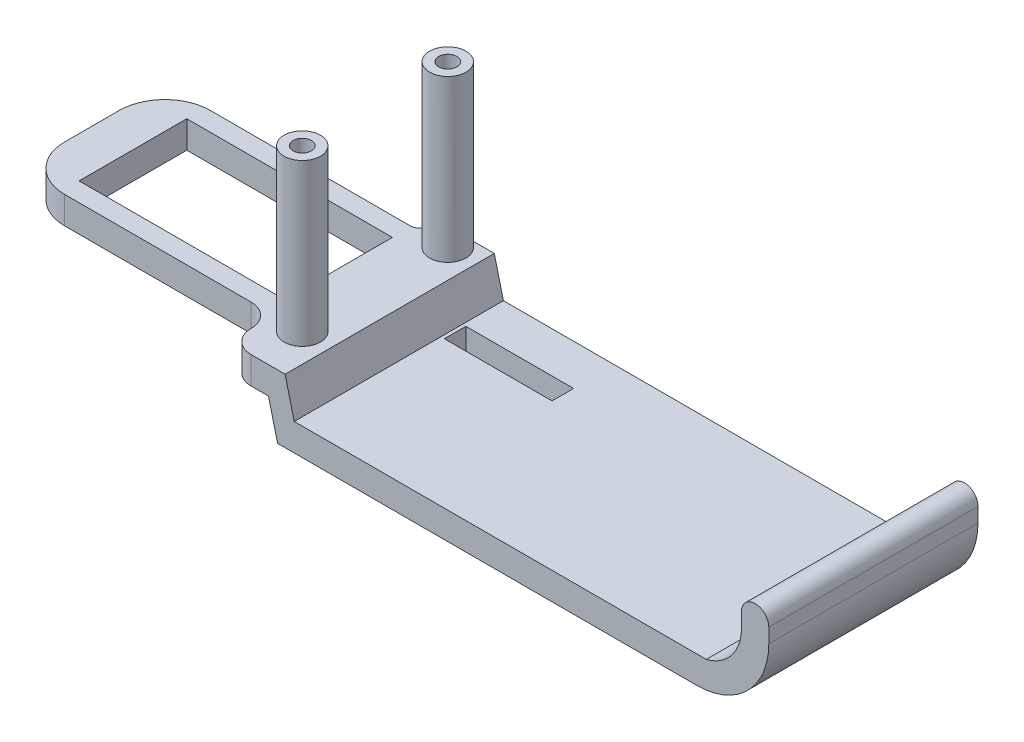
ISO-10303-21;
HEADER;
FILE_DESCRIPTION(('STEP AP214'),'2;1');
FILE_NAME('part.step','',(''),(''),'','','');
FILE_SCHEMA(('AUTOMOTIVE_DESIGN { 1 0 10303 214 1 1 1 1 }'));
ENDSEC;
DATA;
#1=APPLICATION_CONTEXT('core data for automotive mechanical design processes');
#2=APPLICATION_PROTOCOL_DEFINITION('international standard','automotive_design',2000,#1);
#3=PRODUCT_CONTEXT('',#1,'mechanical');
#4=PRODUCT('Part','Part','',(#3));
#5=PRODUCT_RELATED_PRODUCT_CATEGORY('part','',(#4));
#6=PRODUCT_DEFINITION_FORMATION('','',#4);
#7=PRODUCT_DEFINITION_CONTEXT('part definition',#1,'design');
#8=PRODUCT_DEFINITION('design','',#6,#7);
#9=PRODUCT_DEFINITION_SHAPE('','',#8);
#10=(LENGTH_UNIT() NAMED_UNIT(*) SI_UNIT(.MILLI.,.METRE.));
#11=(NAMED_UNIT(*) PLANE_ANGLE_UNIT() SI_UNIT($,.RADIAN.));
#12=(NAMED_UNIT(*) SI_UNIT($,.STERADIAN.) SOLID_ANGLE_UNIT());
#13=UNCERTAINTY_MEASURE_WITH_UNIT(LENGTH_MEASURE(1.E-05),#10,'distance_accuracy_value','');
#14=(GEOMETRIC_REPRESENTATION_CONTEXT(3) GLOBAL_UNCERTAINTY_ASSIGNED_CONTEXT((#13)) GLOBAL_UNIT_ASSIGNED_CONTEXT((#10,
#11,#12)) REPRESENTATION_CONTEXT('',''));
#15=CARTESIAN_POINT('',(0.,0.,0.));
#16=DIRECTION('',(0.,0.,1.));
#17=DIRECTION('',(1.,0.,0.));
#18=AXIS2_PLACEMENT_3D('',#15,#16,#17);
#19=CARTESIAN_POINT('',(0.,3.,0.));
#20=DIRECTION('',(0.,1.,0.));
#21=DIRECTION('',(0.,0.,1.));
#22=AXIS2_PLACEMENT_3D('',#19,#20,#21);
#23=PLANE('',#22);
#24=DIRECTION('',(1.,0.,0.));
#25=VECTOR('',#24,1.);
#26=CARTESIAN_POINT('',(0.,3.,-13.92));
#27=LINE('',#26,#25);
#28=CARTESIAN_POINT('',(4.5,3.,-13.92));
#29=VERTEX_POINT('',#28);
#30=CARTESIAN_POINT('',(27.1,3.,-13.92));
#31=VERTEX_POINT('',#30);
#32=EDGE_CURVE('E376',#29,#31,#27,.T.);
#33=ORIENTED_EDGE('',*,*,#32,.T.);
#34=DIRECTION('',(0.,0.,1.));
#35=VECTOR('',#34,1.);
#36=CARTESIAN_POINT('',(27.1,3.,0.));
#37=LINE('',#36,#35);
#38=CARTESIAN_POINT('',(27.1,3.,-2.08));
#39=VERTEX_POINT('',#38);
#40=EDGE_CURVE('E379',#31,#39,#37,.T.);
#41=ORIENTED_EDGE('',*,*,#40,.T.);
#42=DIRECTION('',(1.,0.,0.));
#43=VECTOR('',#42,1.);
#44=CARTESIAN_POINT('',(0.,3.,-2.08));
#45=LINE('',#44,#43);
#46=CARTESIAN_POINT('',(4.5,3.,-2.08));
#47=VERTEX_POINT('',#46);
#48=EDGE_CURVE('E381',#47,#39,#45,.T.);
#49=ORIENTED_EDGE('',*,*,#48,.F.);
#50=DIRECTION('',(0.,0.,1.));
#51=VECTOR('',#50,1.);
#52=CARTESIAN_POINT('',(4.5,3.,0.));
#53=LINE('',#52,#51);
#54=EDGE_CURVE('E384',#29,#47,#53,.T.);
#55=ORIENTED_EDGE('',*,*,#54,.F.);
#56=EDGE_LOOP('',(#33,#41,#49,#55));
#57=FACE_BOUND('',#56,.T.);
#58=DIRECTION('',(1.,0.,0.));
#59=VECTOR('',#58,1.);
#60=CARTESIAN_POINT('',(0.,3.,0.));
#61=LINE('',#60,#59);
#62=CARTESIAN_POINT('',(5.,3.,0.));
#63=VERTEX_POINT('',#62);
#64=CARTESIAN_POINT('',(25.5,3.,0.));
#65=VERTEX_POINT('',#64);
#66=EDGE_CURVE('E374',#63,#65,#61,.T.);
#67=ORIENTED_EDGE('',*,*,#66,.T.);
#68=CARTESIAN_POINT('',(25.5,3.,2.5));
#69=DIRECTION('',(0.,1.,0.));
#70=DIRECTION('',(0.,0.,1.));
#71=AXIS2_PLACEMENT_3D('',#68,#69,#70);
#72=CIRCLE('',#71,2.5);
#73=CARTESIAN_POINT('',(28.,3.,2.5));
#74=VERTEX_POINT('',#73);
#75=EDGE_CURVE('E11',#65,#74,#72,.F.);
#76=ORIENTED_EDGE('',*,*,#75,.T.);
#77=CARTESIAN_POINT('',(30.5,3.,2.5));
#78=DIRECTION('',(0.,1.,0.));
#79=DIRECTION('',(0.,0.,1.));
#80=AXIS2_PLACEMENT_3D('',#77,#78,#79);
#81=CIRCLE('',#80,2.5);
#82=CARTESIAN_POINT('',(30.5,3.,5.));
#83=VERTEX_POINT('',#82);
#84=EDGE_CURVE('E475',#74,#83,#81,.T.);
#85=ORIENTED_EDGE('',*,*,#84,.T.);
#86=DIRECTION('',(1.,0.,0.));
#87=VECTOR('',#86,1.);
#88=CARTESIAN_POINT('',(28.,3.,5.));
#89=LINE('',#88,#87);
#90=CARTESIAN_POINT('',(34.226941016011,3.,5.));
#91=VERTEX_POINT('',#90);
#92=EDGE_CURVE('E353',#83,#91,#89,.T.);
#93=ORIENTED_EDGE('',*,*,#92,.T.);
#94=DIRECTION('',(0.,0.,-1.));
#95=VECTOR('',#94,1.);
#96=CARTESIAN_POINT('',(34.226941016011,3.,5.));
#97=LINE('',#96,#95);
#98=CARTESIAN_POINT('',(34.226941016011,3.,-18.));
#99=VERTEX_POINT('',#98);
#100=EDGE_CURVE('E364',#91,#99,#97,.T.);
#101=ORIENTED_EDGE('',*,*,#100,.T.);
#102=DIRECTION('',(1.,0.,0.));
#103=VECTOR('',#102,1.);
#104=CARTESIAN_POINT('',(28.,3.,-18.));
#105=LINE('',#104,#103);
#106=CARTESIAN_POINT('',(31.1134705080055,3.,-18.));
#107=VERTEX_POINT('',#106);
#108=EDGE_CURVE('E337',#107,#99,#105,.T.);
#109=ORIENTED_EDGE('',*,*,#108,.F.);
#110=CARTESIAN_POINT('',(31.1134705080055,3.,-16.));
#111=DIRECTION('',(0.,1.,0.));
#112=DIRECTION('',(0.,0.,1.));
#113=AXIS2_PLACEMENT_3D('',#110,#111,#112);
#114=CIRCLE('',#113,2.00000000000002);
#115=EDGE_CURVE('E321',#107,#107,#114,.T.);
#116=ORIENTED_EDGE('',*,*,#115,.F.);
#117=CARTESIAN_POINT('',(29.,3.,-18.));
#118=VERTEX_POINT('',#117);
#119=EDGE_CURVE('E338',#118,#107,#105,.T.);
#120=ORIENTED_EDGE('',*,*,#119,.F.);
#121=CARTESIAN_POINT('',(29.,3.,-17.));
#122=DIRECTION('',(0.,1.,0.));
#123=DIRECTION('',(0.,0.,1.));
#124=AXIS2_PLACEMENT_3D('',#121,#122,#123);
#125=CIRCLE('',#124,1.);
#126=CARTESIAN_POINT('',(28.,3.,-17.));
#127=VERTEX_POINT('',#126);
#128=EDGE_CURVE('E437',#118,#127,#125,.T.);
#129=ORIENTED_EDGE('',*,*,#128,.T.);
#130=CARTESIAN_POINT('',(27.,3.,-17.));
#131=DIRECTION('',(0.,1.,0.));
#132=DIRECTION('',(0.,0.,1.));
#133=AXIS2_PLACEMENT_3D('',#130,#131,#132);
#134=CIRCLE('',#133,1.);
#135=CARTESIAN_POINT('',(27.,3.,-16.));
#136=VERTEX_POINT('',#135);
#137=EDGE_CURVE('E426',#127,#136,#134,.F.);
#138=ORIENTED_EDGE('',*,*,#137,.T.);
#139=DIRECTION('',(1.,0.,0.));
#140=VECTOR('',#139,1.);
#141=CARTESIAN_POINT('',(0.,3.,-16.));
#142=LINE('',#141,#140);
#143=CARTESIAN_POINT('',(5.,3.,-16.));
#144=VERTEX_POINT('',#143);
#145=EDGE_CURVE('E375',#144,#136,#142,.T.);
#146=ORIENTED_EDGE('',*,*,#145,.F.);
#147=CARTESIAN_POINT('',(5.,3.,-11.));
#148=DIRECTION('',(0.,1.,0.));
#149=DIRECTION('',(0.,0.,1.));
#150=AXIS2_PLACEMENT_3D('',#147,#148,#149);
#151=CIRCLE('',#150,5.);
#152=CARTESIAN_POINT('',(0.,3.,-11.));
#153=VERTEX_POINT('',#152);
#154=EDGE_CURVE('E465',#144,#153,#151,.T.);
#155=ORIENTED_EDGE('',*,*,#154,.T.);
#156=DIRECTION('',(0.,0.,1.));
#157=VECTOR('',#156,1.);
#158=CARTESIAN_POINT('',(0.,3.,0.));
#159=LINE('',#158,#157);
#160=CARTESIAN_POINT('',(0.,3.,-5.));
#161=VERTEX_POINT('',#160);
#162=EDGE_CURVE('E371',#153,#161,#159,.T.);
#163=ORIENTED_EDGE('',*,*,#162,.T.);
#164=CARTESIAN_POINT('',(5.,3.,-5.));
#165=DIRECTION('',(0.,1.,0.));
#166=DIRECTION('',(0.,0.,1.));
#167=AXIS2_PLACEMENT_3D('',#164,#165,#166);
#168=CIRCLE('',#167,5.);
#169=EDGE_CURVE('E467',#161,#63,#168,.T.);
#170=ORIENTED_EDGE('',*,*,#169,.T.);
#171=EDGE_LOOP('',(#67,#76,#85,#93,#101,#109,#116,#120,#129,#138,#146,#155,#163,#170));
#172=FACE_BOUND('',#171,.T.);
#173=CARTESIAN_POINT('',(31.1134705080055,3.,0.));
#174=DIRECTION('',(0.,1.,0.));
#175=DIRECTION('',(0.,0.,-1.));
#176=AXIS2_PLACEMENT_3D('',#173,#174,#175);
#177=CIRCLE('',#176,2.00000000000002);
#178=CARTESIAN_POINT('',(31.1134705080055,3.,-2.00000000000002));
#179=VERTEX_POINT('',#178);
#180=EDGE_CURVE('E315',#179,#179,#177,.T.);
#181=ORIENTED_EDGE('',*,*,#180,.F.);
#182=EDGE_LOOP('',(#181));
#183=FACE_BOUND('',#182,.T.);
#184=ADVANCED_FACE('F37',(#57,#172,#183),#23,.T.);
#185=CARTESIAN_POINT('',(0.,3.,-13.92));
#186=DIRECTION('',(0.,0.,-1.));
#187=DIRECTION('',(-1.,0.,0.));
#188=AXIS2_PLACEMENT_3D('',#185,#186,#187);
#189=PLANE('',#188);
#190=DIRECTION('',(1.,0.,0.));
#191=VECTOR('',#190,1.);
#192=CARTESIAN_POINT('',(0.,0.,-13.92));
#193=LINE('',#192,#191);
#194=CARTESIAN_POINT('',(4.5,0.,-13.92));
#195=VERTEX_POINT('',#194);
#196=CARTESIAN_POINT('',(27.1,0.,-13.92));
#197=VERTEX_POINT('',#196);
#198=EDGE_CURVE('E392',#195,#197,#193,.T.);
#199=ORIENTED_EDGE('',*,*,#198,.T.);
#200=DIRECTION('',(0.,-1.,0.));
#201=VECTOR('',#200,1.);
#202=CARTESIAN_POINT('',(27.1,3.,-13.92));
#203=LINE('',#202,#201);
#204=EDGE_CURVE('E409',#31,#197,#203,.T.);
#205=ORIENTED_EDGE('',*,*,#204,.F.);
#206=ORIENTED_EDGE('',*,*,#32,.F.);
#207=DIRECTION('',(0.,-1.,0.));
#208=VECTOR('',#207,1.);
#209=CARTESIAN_POINT('',(4.5,3.,-13.92));
#210=LINE('',#209,#208);
#211=EDGE_CURVE('E387',#29,#195,#210,.T.);
#212=ORIENTED_EDGE('',*,*,#211,.T.);
#213=EDGE_LOOP('',(#199,#205,#206,#212));
#214=FACE_BOUND('',#213,.T.);
#215=ADVANCED_FACE('F533',(#214),#189,.F.);
#216=CARTESIAN_POINT('',(27.1,3.,0.));
#217=DIRECTION('',(1.,0.,0.));
#218=DIRECTION('',(0.,0.,-1.));
#219=AXIS2_PLACEMENT_3D('',#216,#217,#218);
#220=PLANE('',#219);
#221=DIRECTION('',(0.,0.,1.));
#222=VECTOR('',#221,1.);
#223=CARTESIAN_POINT('',(27.1,0.,0.));
#224=LINE('',#223,#222);
#225=CARTESIAN_POINT('',(27.1,0.,-2.08));
#226=VERTEX_POINT('',#225);
#227=EDGE_CURVE('E395',#197,#226,#224,.T.);
#228=ORIENTED_EDGE('',*,*,#227,.T.);
#229=DIRECTION('',(0.,-1.,0.));
#230=VECTOR('',#229,1.);
#231=CARTESIAN_POINT('',(27.1,3.,-2.08));
#232=LINE('',#231,#230);
#233=EDGE_CURVE('E407',#39,#226,#232,.T.);
#234=ORIENTED_EDGE('',*,*,#233,.F.);
#235=ORIENTED_EDGE('',*,*,#40,.F.);
#236=ORIENTED_EDGE('',*,*,#204,.T.);
#237=EDGE_LOOP('',(#228,#234,#235,#236));
#238=FACE_BOUND('',#237,.T.);
#239=ADVANCED_FACE('F539',(#238),#220,.F.);
#240=CARTESIAN_POINT('',(0.,3.,-2.08));
#241=DIRECTION('',(0.,0.,-1.));
#242=DIRECTION('',(-1.,0.,0.));
#243=AXIS2_PLACEMENT_3D('',#240,#241,#242);
#244=PLANE('',#243);
#245=DIRECTION('',(1.,0.,0.));
#246=VECTOR('',#245,1.);
#247=CARTESIAN_POINT('',(0.,0.,-2.08));
#248=LINE('',#247,#246);
#249=CARTESIAN_POINT('',(4.5,0.,-2.08));
#250=VERTEX_POINT('',#249);
#251=EDGE_CURVE('E398',#250,#226,#248,.T.);
#252=ORIENTED_EDGE('',*,*,#251,.F.);
#253=DIRECTION('',(0.,-1.,0.));
#254=VECTOR('',#253,1.);
#255=CARTESIAN_POINT('',(4.5,3.,-2.08));
#256=LINE('',#255,#254);
#257=EDGE_CURVE('E405',#47,#250,#256,.T.);
#258=ORIENTED_EDGE('',*,*,#257,.F.);
#259=ORIENTED_EDGE('',*,*,#48,.T.);
#260=ORIENTED_EDGE('',*,*,#233,.T.);
#261=EDGE_LOOP('',(#252,#258,#259,#260));
#262=FACE_BOUND('',#261,.T.);
#263=ADVANCED_FACE('F552',(#262),#244,.T.);
#264=CARTESIAN_POINT('',(0.,3.,-16.));
#265=DIRECTION('',(0.,0.,-1.));
#266=DIRECTION('',(-1.,0.,0.));
#267=AXIS2_PLACEMENT_3D('',#264,#265,#266);
#268=PLANE('',#267);
#269=DIRECTION('',(1.,0.,0.));
#270=VECTOR('',#269,1.);
#271=CARTESIAN_POINT('',(0.,0.,-16.));
#272=LINE('',#271,#270);
#273=CARTESIAN_POINT('',(5.,0.,-16.));
#274=VERTEX_POINT('',#273);
#275=CARTESIAN_POINT('',(27.,0.,-16.));
#276=VERTEX_POINT('',#275);
#277=EDGE_CURVE('E363',#274,#276,#272,.T.);
#278=ORIENTED_EDGE('',*,*,#277,.F.);
#279=DIRECTION('',(0.,-1.,0.));
#280=VECTOR('',#279,1.);
#281=CARTESIAN_POINT('',(5.,3.,-16.));
#282=LINE('',#281,#280);
#283=EDGE_CURVE('E459',#274,#144,#282,.F.);
#284=ORIENTED_EDGE('',*,*,#283,.T.);
#285=ORIENTED_EDGE('',*,*,#145,.T.);
#286=DIRECTION('',(0.,-1.,0.));
#287=VECTOR('',#286,1.);
#288=CARTESIAN_POINT('',(27.,3.,-16.));
#289=LINE('',#288,#287);
#290=EDGE_CURVE('E439',#136,#276,#289,.T.);
#291=ORIENTED_EDGE('',*,*,#290,.T.);
#292=EDGE_LOOP('',(#278,#284,#285,#291));
#293=FACE_BOUND('',#292,.T.);
#294=ADVANCED_FACE('F457',(#293),#268,.T.);
#295=CARTESIAN_POINT('',(0.,3.,0.));
#296=DIRECTION('',(1.,0.,0.));
#297=DIRECTION('',(0.,0.,-1.));
#298=AXIS2_PLACEMENT_3D('',#295,#296,#297);
#299=PLANE('',#298);
#300=DIRECTION('',(0.,0.,1.));
#301=VECTOR('',#300,1.);
#302=CARTESIAN_POINT('',(0.,0.,0.));
#303=LINE('',#302,#301);
#304=CARTESIAN_POINT('',(0.,0.,-11.));
#305=VERTEX_POINT('',#304);
#306=CARTESIAN_POINT('',(0.,0.,-5.));
#307=VERTEX_POINT('',#306);
#308=EDGE_CURVE('E388',#305,#307,#303,.T.);
#309=ORIENTED_EDGE('',*,*,#308,.T.);
#310=DIRECTION('',(0.,-1.,0.));
#311=VECTOR('',#310,1.);
#312=CARTESIAN_POINT('',(0.,3.,-5.));
#313=LINE('',#312,#311);
#314=EDGE_CURVE('E463',#307,#161,#313,.F.);
#315=ORIENTED_EDGE('',*,*,#314,.T.);
#316=ORIENTED_EDGE('',*,*,#162,.F.);
#317=DIRECTION('',(0.,-1.,0.));
#318=VECTOR('',#317,1.);
#319=CARTESIAN_POINT('',(0.,0.,-11.));
#320=LINE('',#319,#318);
#321=EDGE_CURVE('E514',#153,#305,#320,.T.);
#322=ORIENTED_EDGE('',*,*,#321,.T.);
#323=EDGE_LOOP('',(#309,#315,#316,#322));
#324=FACE_BOUND('',#323,.T.);
#325=ADVANCED_FACE('F518',(#324),#299,.F.);
#326=CARTESIAN_POINT('',(0.,3.,0.));
#327=DIRECTION('',(0.,0.,-1.));
#328=DIRECTION('',(-1.,0.,0.));
#329=AXIS2_PLACEMENT_3D('',#326,#327,#328);
#330=PLANE('',#329);
#331=DIRECTION('',(1.,0.,0.));
#332=VECTOR('',#331,1.);
#333=CARTESIAN_POINT('',(0.,0.,0.));
#334=LINE('',#333,#332);
#335=CARTESIAN_POINT('',(5.,0.,0.));
#336=VERTEX_POINT('',#335);
#337=CARTESIAN_POINT('',(25.5,0.,0.));
#338=VERTEX_POINT('',#337);
#339=EDGE_CURVE('E391',#336,#338,#334,.T.);
#340=ORIENTED_EDGE('',*,*,#339,.T.);
#341=DIRECTION('',(0.,-1.,0.));
#342=VECTOR('',#341,1.);
#343=CARTESIAN_POINT('',(25.5,3.,0.));
#344=LINE('',#343,#342);
#345=EDGE_CURVE('E59',#338,#65,#344,.F.);
#346=ORIENTED_EDGE('',*,*,#345,.T.);
#347=ORIENTED_EDGE('',*,*,#66,.F.);
#348=DIRECTION('',(0.,-1.,0.));
#349=VECTOR('',#348,1.);
#350=CARTESIAN_POINT('',(5.,3.,0.));
#351=LINE('',#350,#349);
#352=EDGE_CURVE('E422',#63,#336,#351,.T.);
#353=ORIENTED_EDGE('',*,*,#352,.T.);
#354=EDGE_LOOP('',(#340,#346,#347,#353));
#355=FACE_BOUND('',#354,.T.);
#356=ADVANCED_FACE('F486',(#355),#330,.F.);
#357=CARTESIAN_POINT('',(4.5,3.,0.));
#358=DIRECTION('',(1.,0.,0.));
#359=DIRECTION('',(0.,0.,-1.));
#360=AXIS2_PLACEMENT_3D('',#357,#358,#359);
#361=PLANE('',#360);
#362=DIRECTION('',(0.,0.,1.));
#363=VECTOR('',#362,1.);
#364=CARTESIAN_POINT('',(4.5,0.,0.));
#365=LINE('',#364,#363);
#366=EDGE_CURVE('E401',#195,#250,#365,.T.);
#367=ORIENTED_EDGE('',*,*,#366,.F.);
#368=ORIENTED_EDGE('',*,*,#211,.F.);
#369=ORIENTED_EDGE('',*,*,#54,.T.);
#370=ORIENTED_EDGE('',*,*,#257,.T.);
#371=EDGE_LOOP('',(#367,#368,#369,#370));
#372=FACE_BOUND('',#371,.T.);
#373=ADVANCED_FACE('F548',(#372),#361,.T.);
#374=CARTESIAN_POINT('',(0.,0.,0.));
#375=DIRECTION('',(0.,1.,0.));
#376=DIRECTION('',(0.,0.,1.));
#377=AXIS2_PLACEMENT_3D('',#374,#375,#376);
#378=PLANE('',#377);
#379=DIRECTION('',(1.,0.,0.));
#380=VECTOR('',#379,1.);
#381=CARTESIAN_POINT('',(28.,0.,5.));
#382=LINE('',#381,#380);
#383=CARTESIAN_POINT('',(30.5,0.,5.));
#384=VERTEX_POINT('',#383);
#385=CARTESIAN_POINT('',(32.4,0.,5.));
#386=VERTEX_POINT('',#385);
#387=EDGE_CURVE('E351',#384,#386,#382,.T.);
#388=ORIENTED_EDGE('',*,*,#387,.F.);
#389=CARTESIAN_POINT('',(30.5,0.,2.5));
#390=DIRECTION('',(0.,1.,0.));
#391=DIRECTION('',(0.,0.,1.));
#392=AXIS2_PLACEMENT_3D('',#389,#390,#391);
#393=CIRCLE('',#392,2.5);
#394=CARTESIAN_POINT('',(28.,0.,2.5));
#395=VERTEX_POINT('',#394);
#396=EDGE_CURVE('E473',#384,#395,#393,.F.);
#397=ORIENTED_EDGE('',*,*,#396,.T.);
#398=CARTESIAN_POINT('',(25.5,0.,2.5));
#399=DIRECTION('',(0.,1.,0.));
#400=DIRECTION('',(0.,0.,1.));
#401=AXIS2_PLACEMENT_3D('',#398,#399,#400);
#402=CIRCLE('',#401,2.5);
#403=EDGE_CURVE('E46',#395,#338,#402,.T.);
#404=ORIENTED_EDGE('',*,*,#403,.T.);
#405=ORIENTED_EDGE('',*,*,#339,.F.);
#406=CARTESIAN_POINT('',(5.,0.,-5.));
#407=DIRECTION('',(0.,1.,0.));
#408=DIRECTION('',(0.,0.,1.));
#409=AXIS2_PLACEMENT_3D('',#406,#407,#408);
#410=CIRCLE('',#409,5.);
#411=EDGE_CURVE('E513',#336,#307,#410,.F.);
#412=ORIENTED_EDGE('',*,*,#411,.T.);
#413=ORIENTED_EDGE('',*,*,#308,.F.);
#414=CARTESIAN_POINT('',(5.,0.,-11.));
#415=DIRECTION('',(0.,1.,0.));
#416=DIRECTION('',(0.,0.,1.));
#417=AXIS2_PLACEMENT_3D('',#414,#415,#416);
#418=CIRCLE('',#417,5.);
#419=EDGE_CURVE('E425',#305,#274,#418,.F.);
#420=ORIENTED_EDGE('',*,*,#419,.T.);
#421=ORIENTED_EDGE('',*,*,#277,.T.);
#422=CARTESIAN_POINT('',(27.,0.,-17.));
#423=DIRECTION('',(0.,1.,0.));
#424=DIRECTION('',(0.,0.,1.));
#425=AXIS2_PLACEMENT_3D('',#422,#423,#424);
#426=CIRCLE('',#425,1.);
#427=CARTESIAN_POINT('',(28.,0.,-17.));
#428=VERTEX_POINT('',#427);
#429=EDGE_CURVE('E442',#276,#428,#426,.T.);
#430=ORIENTED_EDGE('',*,*,#429,.T.);
#431=CARTESIAN_POINT('',(29.,0.,-17.));
#432=DIRECTION('',(0.,1.,0.));
#433=DIRECTION('',(0.,0.,1.));
#434=AXIS2_PLACEMENT_3D('',#431,#432,#433);
#435=CIRCLE('',#434,1.);
#436=CARTESIAN_POINT('',(29.,0.,-18.));
#437=VERTEX_POINT('',#436);
#438=EDGE_CURVE('E412',#428,#437,#435,.F.);
#439=ORIENTED_EDGE('',*,*,#438,.T.);
#440=DIRECTION('',(1.,0.,0.));
#441=VECTOR('',#440,1.);
#442=CARTESIAN_POINT('',(28.,0.,-18.));
#443=LINE('',#442,#441);
#444=CARTESIAN_POINT('',(32.4,0.,-18.));
#445=VERTEX_POINT('',#444);
#446=EDGE_CURVE('E335',#437,#445,#443,.T.);
#447=ORIENTED_EDGE('',*,*,#446,.T.);
#448=DIRECTION('',(0.,0.,-1.));
#449=VECTOR('',#448,1.);
#450=CARTESIAN_POINT('',(32.4,0.,5.));
#451=LINE('',#450,#449);
#452=EDGE_CURVE('E367',#386,#445,#451,.T.);
#453=ORIENTED_EDGE('',*,*,#452,.F.);
#454=EDGE_LOOP('',(#388,#397,#404,#405,#412,#413,#420,#421,#430,#439,#447,#453));
#455=FACE_BOUND('',#454,.T.);
#456=ORIENTED_EDGE('',*,*,#198,.F.);
#457=ORIENTED_EDGE('',*,*,#366,.T.);
#458=ORIENTED_EDGE('',*,*,#251,.T.);
#459=ORIENTED_EDGE('',*,*,#227,.F.);
#460=EDGE_LOOP('',(#456,#457,#458,#459));
#461=FACE_BOUND('',#460,.T.);
#462=ADVANCED_FACE('F482',(#455,#461),#378,.F.);
#463=CARTESIAN_POINT('',(62.4,-4.,5.));
#464=DIRECTION('',(0.,-1.,0.));
#465=DIRECTION('',(1.,0.,0.));
#466=AXIS2_PLACEMENT_3D('',#463,#464,#465);
#467=PLANE('',#466);
#468=DIRECTION('',(0.,0.,-1.));
#469=VECTOR('',#468,1.);
#470=CARTESIAN_POINT('',(35.6,-4.,5.));
#471=LINE('',#470,#469);
#472=CARTESIAN_POINT('',(35.6,-4.,-11.13));
#473=VERTEX_POINT('',#472);
#474=CARTESIAN_POINT('',(35.6,-4.,-13.5));
#475=VERTEX_POINT('',#474);
#476=EDGE_CURVE('E303',#473,#475,#471,.T.);
#477=ORIENTED_EDGE('',*,*,#476,.F.);
#478=DIRECTION('',(-1.,0.,0.));
#479=VECTOR('',#478,1.);
#480=CARTESIAN_POINT('',(62.4,-4.,-11.13));
#481=LINE('',#480,#479);
#482=CARTESIAN_POINT('',(47.44,-4.,-11.13));
#483=VERTEX_POINT('',#482);
#484=EDGE_CURVE('E290',#483,#473,#481,.T.);
#485=ORIENTED_EDGE('',*,*,#484,.F.);
#486=DIRECTION('',(0.,0.,1.));
#487=VECTOR('',#486,1.);
#488=CARTESIAN_POINT('',(47.44,-4.,5.));
#489=LINE('',#488,#487);
#490=CARTESIAN_POINT('',(47.44,-4.,-13.5));
#491=VERTEX_POINT('',#490);
#492=EDGE_CURVE('E298',#491,#483,#489,.T.);
#493=ORIENTED_EDGE('',*,*,#492,.F.);
#494=DIRECTION('',(1.,0.,0.));
#495=VECTOR('',#494,1.);
#496=CARTESIAN_POINT('',(62.4,-4.,-13.5));
#497=LINE('',#496,#495);
#498=EDGE_CURVE('E301',#475,#491,#497,.T.);
#499=ORIENTED_EDGE('',*,*,#498,.F.);
#500=EDGE_LOOP('',(#477,#485,#493,#499));
#501=FACE_BOUND('',#500,.T.);
#502=DIRECTION('',(0.,0.,-1.));
#503=VECTOR('',#502,1.);
#504=CARTESIAN_POINT('',(33.4,-4.,5.));
#505=LINE('',#504,#503);
#506=CARTESIAN_POINT('',(33.4,-4.,5.));
#507=VERTEX_POINT('',#506);
#508=CARTESIAN_POINT('',(33.4,-4.,-18.));
#509=VERTEX_POINT('',#508);
#510=EDGE_CURVE('E360',#507,#509,#505,.T.);
#511=ORIENTED_EDGE('',*,*,#510,.T.);
#512=DIRECTION('',(-1.,0.,0.));
#513=VECTOR('',#512,1.);
#514=CARTESIAN_POINT('',(62.4,-4.,-18.));
#515=LINE('',#514,#513);
#516=CARTESIAN_POINT('',(79.4805511045049,-4.,-18.));
#517=VERTEX_POINT('',#516);
#518=EDGE_CURVE('E327',#517,#509,#515,.T.);
#519=ORIENTED_EDGE('',*,*,#518,.F.);
#520=DIRECTION('',(0.,0.,1.));
#521=VECTOR('',#520,1.);
#522=CARTESIAN_POINT('',(79.4805511045049,-4.,-45.3130005674953));
#523=LINE('',#522,#521);
#524=CARTESIAN_POINT('',(79.4805511045049,-4.,5.));
#525=VERTEX_POINT('',#524);
#526=EDGE_CURVE('E266',#517,#525,#523,.T.);
#527=ORIENTED_EDGE('',*,*,#526,.T.);
#528=DIRECTION('',(-1.,0.,0.));
#529=VECTOR('',#528,1.);
#530=CARTESIAN_POINT('',(62.4,-4.,5.));
#531=LINE('',#530,#529);
#532=EDGE_CURVE('E345',#525,#507,#531,.T.);
#533=ORIENTED_EDGE('',*,*,#532,.T.);
#534=EDGE_LOOP('',(#511,#519,#527,#533));
#535=FACE_BOUND('',#534,.T.);
#536=ADVANCED_FACE('F544',(#501,#535),#467,.T.);
#537=CARTESIAN_POINT('',(35.226941016011,-1.,5.));
#538=DIRECTION('',(0.,1.,0.));
#539=DIRECTION('',(0.,0.,1.));
#540=AXIS2_PLACEMENT_3D('',#537,#538,#539);
#541=PLANE('',#540);
#542=DIRECTION('',(0.,0.,1.));
#543=VECTOR('',#542,1.);
#544=CARTESIAN_POINT('',(35.6,-1.,-13.5));
#545=LINE('',#544,#543);
#546=CARTESIAN_POINT('',(35.6,-1.,-13.5));
#547=VERTEX_POINT('',#546);
#548=CARTESIAN_POINT('',(35.6,-1.,-11.13));
#549=VERTEX_POINT('',#548);
#550=EDGE_CURVE('E275',#547,#549,#545,.T.);
#551=ORIENTED_EDGE('',*,*,#550,.F.);
#552=DIRECTION('',(-1.,0.,0.));
#553=VECTOR('',#552,1.);
#554=CARTESIAN_POINT('',(35.6,-1.,-13.5));
#555=LINE('',#554,#553);
#556=CARTESIAN_POINT('',(47.44,-1.,-13.5));
#557=VERTEX_POINT('',#556);
#558=EDGE_CURVE('E284',#557,#547,#555,.T.);
#559=ORIENTED_EDGE('',*,*,#558,.F.);
#560=DIRECTION('',(0.,0.,-1.));
#561=VECTOR('',#560,1.);
#562=CARTESIAN_POINT('',(47.44,-1.,-13.5));
#563=LINE('',#562,#561);
#564=CARTESIAN_POINT('',(47.44,-1.,-11.13));
#565=VERTEX_POINT('',#564);
#566=EDGE_CURVE('E281',#565,#557,#563,.T.);
#567=ORIENTED_EDGE('',*,*,#566,.F.);
#568=DIRECTION('',(1.,0.,0.));
#569=VECTOR('',#568,1.);
#570=CARTESIAN_POINT('',(35.6,-1.,-11.13));
#571=LINE('',#570,#569);
#572=EDGE_CURVE('E277',#549,#565,#571,.T.);
#573=ORIENTED_EDGE('',*,*,#572,.F.);
#574=EDGE_LOOP('',(#551,#559,#567,#573));
#575=FACE_BOUND('',#574,.T.);
#576=DIRECTION('',(1.,0.,0.));
#577=VECTOR('',#576,1.);
#578=CARTESIAN_POINT('',(35.226941016011,-1.,5.));
#579=LINE('',#578,#577);
#580=CARTESIAN_POINT('',(35.226941016011,-1.,5.));
#581=VERTEX_POINT('',#580);
#582=CARTESIAN_POINT('',(80.5280637219048,-1.,5.));
#583=VERTEX_POINT('',#582);
#584=EDGE_CURVE('E358',#581,#583,#579,.T.);
#585=ORIENTED_EDGE('',*,*,#584,.T.);
#586=DIRECTION('',(0.,0.,1.));
#587=VECTOR('',#586,1.);
#588=CARTESIAN_POINT('',(80.5280637219048,-1.,-45.3130005674953));
#589=LINE('',#588,#587);
#590=CARTESIAN_POINT('',(80.5280637219048,-1.00000000000001,-18.));
#591=VERTEX_POINT('',#590);
#592=EDGE_CURVE('E269',#591,#583,#589,.T.);
#593=ORIENTED_EDGE('',*,*,#592,.F.);
#594=DIRECTION('',(1.,0.,0.));
#595=VECTOR('',#594,1.);
#596=CARTESIAN_POINT('',(35.226941016011,-1.,-18.));
#597=LINE('',#596,#595);
#598=CARTESIAN_POINT('',(35.226941016011,-1.,-18.));
#599=VERTEX_POINT('',#598);
#600=EDGE_CURVE('E343',#599,#591,#597,.T.);
#601=ORIENTED_EDGE('',*,*,#600,.F.);
#602=DIRECTION('',(0.,0.,-1.));
#603=VECTOR('',#602,1.);
#604=CARTESIAN_POINT('',(35.226941016011,-1.,5.));
#605=LINE('',#604,#603);
#606=EDGE_CURVE('E361',#581,#599,#605,.T.);
#607=ORIENTED_EDGE('',*,*,#606,.F.);
#608=EDGE_LOOP('',(#585,#593,#601,#607));
#609=FACE_BOUND('',#608,.T.);
#610=ADVANCED_FACE('F621',(#575,#609),#541,.T.);
#611=CARTESIAN_POINT('',(34.226941016011,3.,5.));
#612=DIRECTION('',(0.970142500145332,0.242535625036333,0.));
#613=DIRECTION('',(-0.242535625036333,0.970142500145332,0.));
#614=AXIS2_PLACEMENT_3D('',#611,#612,#613);
#615=PLANE('',#614);
#616=ORIENTED_EDGE('',*,*,#606,.T.);
#617=DIRECTION('',(0.242535625036333,-0.970142500145332,0.));
#618=VECTOR('',#617,1.);
#619=CARTESIAN_POINT('',(34.226941016011,3.,-18.));
#620=LINE('',#619,#618);
#621=EDGE_CURVE('E340',#99,#599,#620,.T.);
#622=ORIENTED_EDGE('',*,*,#621,.F.);
#623=ORIENTED_EDGE('',*,*,#100,.F.);
#624=DIRECTION('',(0.242535625036333,-0.970142500145332,0.));
#625=VECTOR('',#624,1.);
#626=CARTESIAN_POINT('',(34.226941016011,3.,5.));
#627=LINE('',#626,#625);
#628=EDGE_CURVE('E355',#91,#581,#627,.T.);
#629=ORIENTED_EDGE('',*,*,#628,.T.);
#630=EDGE_LOOP('',(#616,#622,#623,#629));
#631=FACE_BOUND('',#630,.T.);
#632=ADVANCED_FACE('F496',(#631),#615,.T.);
#633=CARTESIAN_POINT('',(33.4,-4.,5.));
#634=DIRECTION('',(-0.970142500145332,-0.242535625036333,0.));
#635=DIRECTION('',(0.242535625036333,-0.970142500145332,0.));
#636=AXIS2_PLACEMENT_3D('',#633,#634,#635);
#637=PLANE('',#636);
#638=ORIENTED_EDGE('',*,*,#452,.T.);
#639=DIRECTION('',(-0.242535625036333,0.970142500145332,0.));
#640=VECTOR('',#639,1.);
#641=CARTESIAN_POINT('',(33.4,-4.,-18.));
#642=LINE('',#641,#640);
#643=EDGE_CURVE('E332',#509,#445,#642,.T.);
#644=ORIENTED_EDGE('',*,*,#643,.F.);
#645=ORIENTED_EDGE('',*,*,#510,.F.);
#646=DIRECTION('',(-0.242535625036333,0.970142500145332,0.));
#647=VECTOR('',#646,1.);
#648=CARTESIAN_POINT('',(33.4,-4.,5.));
#649=LINE('',#648,#647);
#650=EDGE_CURVE('E348',#507,#386,#649,.T.);
#651=ORIENTED_EDGE('',*,*,#650,.T.);
#652=EDGE_LOOP('',(#638,#644,#645,#651));
#653=FACE_BOUND('',#652,.T.);
#654=ADVANCED_FACE('F620',(#653),#637,.T.);
#655=CARTESIAN_POINT('',(0.,0.,5.));
#656=DIRECTION('',(0.,0.,1.));
#657=DIRECTION('',(1.,0.,0.));
#658=AXIS2_PLACEMENT_3D('',#655,#656,#657);
#659=PLANE('',#658);
#660=ORIENTED_EDGE('',*,*,#92,.F.);
#661=DIRECTION('',(0.,-1.,0.));
#662=VECTOR('',#661,1.);
#663=CARTESIAN_POINT('',(30.5,0.,5.));
#664=LINE('',#663,#662);
#665=EDGE_CURVE('E470',#83,#384,#664,.T.);
#666=ORIENTED_EDGE('',*,*,#665,.T.);
#667=ORIENTED_EDGE('',*,*,#387,.T.);
#668=ORIENTED_EDGE('',*,*,#650,.F.);
#669=ORIENTED_EDGE('',*,*,#532,.F.);
#670=CARTESIAN_POINT('',(79.4805511045049,3.91944889549511,5.));
#671=DIRECTION('',(0.,0.,1.));
#672=DIRECTION('',(1.,0.,0.));
#673=AXIS2_PLACEMENT_3D('',#670,#671,#672);
#674=CIRCLE('',#673,7.91944889549511);
#675=CARTESIAN_POINT('',(87.4,3.91944889549511,5.));
#676=VERTEX_POINT('',#675);
#677=EDGE_CURVE('E258',#525,#676,#674,.T.);
#678=ORIENTED_EDGE('',*,*,#677,.T.);
#679=DIRECTION('',(0.,-1.,0.));
#680=VECTOR('',#679,1.);
#681=CARTESIAN_POINT('',(87.4,0.,5.));
#682=LINE('',#681,#680);
#683=CARTESIAN_POINT('',(87.4,5.5,5.));
#684=VERTEX_POINT('',#683);
#685=EDGE_CURVE('E237',#684,#676,#682,.T.);
#686=ORIENTED_EDGE('',*,*,#685,.F.);
#687=CARTESIAN_POINT('',(85.9,5.5,5.));
#688=DIRECTION('',(0.,0.,1.));
#689=DIRECTION('',(1.,0.,0.));
#690=AXIS2_PLACEMENT_3D('',#687,#688,#689);
#691=CIRCLE('',#690,1.5);
#692=CARTESIAN_POINT('',(84.4,5.5,5.));
#693=VERTEX_POINT('',#692);
#694=EDGE_CURVE('E232',#693,#684,#691,.F.);
#695=ORIENTED_EDGE('',*,*,#694,.F.);
#696=DIRECTION('',(0.,1.,0.));
#697=VECTOR('',#696,1.);
#698=CARTESIAN_POINT('',(84.4000000000001,7.41061321991516E-13,5.));
#699=LINE('',#698,#697);
#700=CARTESIAN_POINT('',(84.4,3.91944889549511,5.));
#701=VERTEX_POINT('',#700);
#702=EDGE_CURVE('E240',#701,#693,#699,.T.);
#703=ORIENTED_EDGE('',*,*,#702,.F.);
#704=CARTESIAN_POINT('',(79.3388542111676,3.91944889549511,5.));
#705=DIRECTION('',(0.,0.,1.));
#706=DIRECTION('',(1.,0.,0.));
#707=AXIS2_PLACEMENT_3D('',#704,#705,#706);
#708=CIRCLE('',#707,5.0611457888324);
#709=EDGE_CURVE('E246',#583,#701,#708,.T.);
#710=ORIENTED_EDGE('',*,*,#709,.F.);
#711=ORIENTED_EDGE('',*,*,#584,.F.);
#712=ORIENTED_EDGE('',*,*,#628,.F.);
#713=EDGE_LOOP('',(#660,#666,#667,#668,#669,#678,#686,#695,#703,#710,#711,#712));
#714=FACE_BOUND('',#713,.T.);
#715=ADVANCED_FACE('F250',(#714),#659,.T.);
#716=CARTESIAN_POINT('',(0.,0.,-18.));
#717=DIRECTION('',(0.,0.,1.));
#718=DIRECTION('',(1.,0.,0.));
#719=AXIS2_PLACEMENT_3D('',#716,#717,#718);
#720=PLANE('',#719);
#721=ORIENTED_EDGE('',*,*,#446,.F.);
#722=DIRECTION('',(0.,-1.,0.));
#723=VECTOR('',#722,1.);
#724=CARTESIAN_POINT('',(29.,0.,-18.));
#725=LINE('',#724,#723);
#726=EDGE_CURVE('E434',#437,#118,#725,.F.);
#727=ORIENTED_EDGE('',*,*,#726,.T.);
#728=ORIENTED_EDGE('',*,*,#119,.T.);
#729=ORIENTED_EDGE('',*,*,#108,.T.);
#730=ORIENTED_EDGE('',*,*,#621,.T.);
#731=ORIENTED_EDGE('',*,*,#600,.T.);
#732=CARTESIAN_POINT('',(79.3388542111676,3.91944889549511,-18.));
#733=DIRECTION('',(0.,0.,1.));
#734=DIRECTION('',(1.,0.,0.));
#735=AXIS2_PLACEMENT_3D('',#732,#733,#734);
#736=CIRCLE('',#735,5.0611457888324);
#737=CARTESIAN_POINT('',(84.4,3.91944889549511,-18.));
#738=VERTEX_POINT('',#737);
#739=EDGE_CURVE('E274',#738,#591,#736,.F.);
#740=ORIENTED_EDGE('',*,*,#739,.F.);
#741=DIRECTION('',(0.,-1.,0.));
#742=VECTOR('',#741,1.);
#743=CARTESIAN_POINT('',(84.4000000000001,7.41061321991516E-13,-18.));
#744=LINE('',#743,#742);
#745=CARTESIAN_POINT('',(84.4,5.5,-18.));
#746=VERTEX_POINT('',#745);
#747=EDGE_CURVE('E263',#746,#738,#744,.T.);
#748=ORIENTED_EDGE('',*,*,#747,.F.);
#749=CARTESIAN_POINT('',(85.9,5.5,-18.));
#750=DIRECTION('',(0.,0.,1.));
#751=DIRECTION('',(1.,0.,0.));
#752=AXIS2_PLACEMENT_3D('',#749,#750,#751);
#753=CIRCLE('',#752,1.5);
#754=CARTESIAN_POINT('',(87.4,5.5,-18.));
#755=VERTEX_POINT('',#754);
#756=EDGE_CURVE('E233',#755,#746,#753,.T.);
#757=ORIENTED_EDGE('',*,*,#756,.F.);
#758=DIRECTION('',(0.,1.,0.));
#759=VECTOR('',#758,1.);
#760=CARTESIAN_POINT('',(87.4,0.,-18.));
#761=LINE('',#760,#759);
#762=CARTESIAN_POINT('',(87.4,3.91944889549511,-18.));
#763=VERTEX_POINT('',#762);
#764=EDGE_CURVE('E644',#763,#755,#761,.T.);
#765=ORIENTED_EDGE('',*,*,#764,.F.);
#766=CARTESIAN_POINT('',(79.4805511045049,3.91944889549511,-18.));
#767=DIRECTION('',(0.,0.,1.));
#768=DIRECTION('',(1.,0.,0.));
#769=AXIS2_PLACEMENT_3D('',#766,#767,#768);
#770=CIRCLE('',#769,7.91944889549511);
#771=EDGE_CURVE('E634',#763,#517,#770,.F.);
#772=ORIENTED_EDGE('',*,*,#771,.T.);
#773=ORIENTED_EDGE('',*,*,#518,.T.);
#774=ORIENTED_EDGE('',*,*,#643,.T.);
#775=EDGE_LOOP('',(#721,#727,#728,#729,#730,#731,#740,#748,#757,#765,#772,#773,#774));
#776=FACE_BOUND('',#775,.T.);
#777=ADVANCED_FACE('F502',(#776),#720,.F.);
#778=CARTESIAN_POINT('',(31.1134705080055,20.7,-16.));
#779=DIRECTION('',(0.,-1.,0.));
#780=DIRECTION('',(0.,0.,-1.));
#781=AXIS2_PLACEMENT_3D('',#778,#779,#780);
#782=CYLINDRICAL_SURFACE('',#781,2.00000000000002);
#783=CARTESIAN_POINT('',(31.1134705080055,20.7,-16.));
#784=DIRECTION('',(0.,1.,0.));
#785=DIRECTION('',(0.,0.,1.));
#786=AXIS2_PLACEMENT_3D('',#783,#784,#785);
#787=CIRCLE('',#786,2.00000000000002);
#788=CARTESIAN_POINT('',(31.1134705080055,20.7,-14.));
#789=VERTEX_POINT('',#788);
#790=EDGE_CURVE('E324',#789,#789,#787,.T.);
#791=ORIENTED_EDGE('',*,*,#790,.F.);
#792=EDGE_LOOP('',(#791));
#793=FACE_BOUND('',#792,.T.);
#794=ORIENTED_EDGE('',*,*,#115,.T.);
#795=EDGE_LOOP('',(#794));
#796=FACE_BOUND('',#795,.T.);
#797=ADVANCED_FACE('F611',(#793,#796),#782,.T.);
#798=CARTESIAN_POINT('',(31.1134705080055,20.7,-16.));
#799=DIRECTION('',(0.,1.,0.));
#800=DIRECTION('',(0.,0.,1.));
#801=AXIS2_PLACEMENT_3D('',#798,#799,#800);
#802=PLANE('',#801);
#803=CARTESIAN_POINT('',(31.1134705080055,20.7,-16.));
#804=DIRECTION('',(0.,1.,0.));
#805=DIRECTION('',(0.,0.,1.));
#806=AXIS2_PLACEMENT_3D('',#803,#804,#805);
#807=CIRCLE('',#806,0.999999999999991);
#808=CARTESIAN_POINT('',(31.1134705080055,20.7,-15.));
#809=VERTEX_POINT('',#808);
#810=EDGE_CURVE('E309',#809,#809,#807,.T.);
#811=ORIENTED_EDGE('',*,*,#810,.F.);
#812=EDGE_LOOP('',(#811));
#813=FACE_BOUND('',#812,.T.);
#814=ORIENTED_EDGE('',*,*,#790,.T.);
#815=EDGE_LOOP('',(#814));
#816=FACE_BOUND('',#815,.T.);
#817=ADVANCED_FACE('F607',(#813,#816),#802,.T.);
#818=CARTESIAN_POINT('',(31.1134705080055,20.7,0.));
#819=DIRECTION('',(0.,-1.,0.));
#820=DIRECTION('',(0.,0.,-1.));
#821=AXIS2_PLACEMENT_3D('',#818,#819,#820);
#822=CYLINDRICAL_SURFACE('',#821,2.00000000000002);
#823=CARTESIAN_POINT('',(31.1134705080055,20.7,0.));
#824=DIRECTION('',(0.,1.,0.));
#825=DIRECTION('',(0.,0.,-1.));
#826=AXIS2_PLACEMENT_3D('',#823,#824,#825);
#827=CIRCLE('',#826,2.00000000000002);
#828=CARTESIAN_POINT('',(31.1134705080055,20.7,-2.00000000000002));
#829=VERTEX_POINT('',#828);
#830=EDGE_CURVE('E318',#829,#829,#827,.T.);
#831=ORIENTED_EDGE('',*,*,#830,.F.);
#832=EDGE_LOOP('',(#831));
#833=FACE_BOUND('',#832,.T.);
#834=ORIENTED_EDGE('',*,*,#180,.T.);
#835=EDGE_LOOP('',(#834));
#836=FACE_BOUND('',#835,.T.);
#837=ADVANCED_FACE('F603',(#833,#836),#822,.T.);
#838=CARTESIAN_POINT('',(31.1134705080055,20.7,0.));
#839=DIRECTION('',(0.,-1.,0.));
#840=DIRECTION('',(0.,0.,-1.));
#841=AXIS2_PLACEMENT_3D('',#838,#839,#840);
#842=PLANE('',#841);
#843=CARTESIAN_POINT('',(31.1134705080055,20.7,0.));
#844=DIRECTION('',(0.,1.,0.));
#845=DIRECTION('',(0.,0.,1.));
#846=AXIS2_PLACEMENT_3D('',#843,#844,#845);
#847=CIRCLE('',#846,0.99999999999999);
#848=CARTESIAN_POINT('',(31.1134705080055,20.7,0.99999999999999));
#849=VERTEX_POINT('',#848);
#850=EDGE_CURVE('E305',#849,#849,#847,.T.);
#851=ORIENTED_EDGE('',*,*,#850,.F.);
#852=EDGE_LOOP('',(#851));
#853=FACE_BOUND('',#852,.T.);
#854=ORIENTED_EDGE('',*,*,#830,.T.);
#855=EDGE_LOOP('',(#854));
#856=FACE_BOUND('',#855,.T.);
#857=ADVANCED_FACE('F599',(#853,#856),#842,.F.);
#858=CARTESIAN_POINT('',(31.1134705080055,16.7,-16.));
#859=DIRECTION('',(0.,1.,0.));
#860=DIRECTION('',(0.,0.,1.));
#861=AXIS2_PLACEMENT_3D('',#858,#859,#860);
#862=CYLINDRICAL_SURFACE('',#861,0.999999999999991);
#863=CARTESIAN_POINT('',(31.1134705080055,16.7,-16.));
#864=DIRECTION('',(0.,1.,0.));
#865=DIRECTION('',(0.,0.,1.));
#866=AXIS2_PLACEMENT_3D('',#863,#864,#865);
#867=CIRCLE('',#866,0.999999999999991);
#868=CARTESIAN_POINT('',(31.1134705080055,16.7,-15.));
#869=VERTEX_POINT('',#868);
#870=EDGE_CURVE('E312',#869,#869,#867,.T.);
#871=ORIENTED_EDGE('',*,*,#870,.F.);
#872=EDGE_LOOP('',(#871));
#873=FACE_BOUND('',#872,.T.);
#874=ORIENTED_EDGE('',*,*,#810,.T.);
#875=EDGE_LOOP('',(#874));
#876=FACE_BOUND('',#875,.T.);
#877=ADVANCED_FACE('F595',(#873,#876),#862,.F.);
#878=CARTESIAN_POINT('',(31.1134705080055,16.7,-16.));
#879=DIRECTION('',(0.,1.,0.));
#880=DIRECTION('',(0.,0.,1.));
#881=AXIS2_PLACEMENT_3D('',#878,#879,#880);
#882=PLANE('',#881);
#883=ORIENTED_EDGE('',*,*,#870,.T.);
#884=EDGE_LOOP('',(#883));
#885=FACE_BOUND('',#884,.T.);
#886=ADVANCED_FACE('F591',(#885),#882,.T.);
#887=CARTESIAN_POINT('',(31.1134705080055,16.7,0.));
#888=DIRECTION('',(0.,1.,0.));
#889=DIRECTION('',(0.,0.,1.));
#890=AXIS2_PLACEMENT_3D('',#887,#888,#889);
#891=CYLINDRICAL_SURFACE('',#890,0.99999999999999);
#892=CARTESIAN_POINT('',(31.1134705080055,16.7,0.));
#893=DIRECTION('',(0.,1.,0.));
#894=DIRECTION('',(0.,0.,1.));
#895=AXIS2_PLACEMENT_3D('',#892,#893,#894);
#896=CIRCLE('',#895,0.99999999999999);
#897=CARTESIAN_POINT('',(31.1134705080055,16.7,0.99999999999999));
#898=VERTEX_POINT('',#897);
#899=EDGE_CURVE('E306',#898,#898,#896,.T.);
#900=ORIENTED_EDGE('',*,*,#899,.F.);
#901=EDGE_LOOP('',(#900));
#902=FACE_BOUND('',#901,.T.);
#903=ORIENTED_EDGE('',*,*,#850,.T.);
#904=EDGE_LOOP('',(#903));
#905=FACE_BOUND('',#904,.T.);
#906=ADVANCED_FACE('F587',(#902,#905),#891,.F.);
#907=CARTESIAN_POINT('',(31.1134705080055,16.7,0.));
#908=DIRECTION('',(0.,1.,0.));
#909=DIRECTION('',(0.,0.,1.));
#910=AXIS2_PLACEMENT_3D('',#907,#908,#909);
#911=PLANE('',#910);
#912=ORIENTED_EDGE('',*,*,#899,.T.);
#913=EDGE_LOOP('',(#912));
#914=FACE_BOUND('',#913,.T.);
#915=ADVANCED_FACE('F583',(#914),#911,.T.);
#916=CARTESIAN_POINT('',(35.6,-11.,-13.5));
#917=DIRECTION('',(-1.,0.,0.));
#918=DIRECTION('',(0.,0.,1.));
#919=AXIS2_PLACEMENT_3D('',#916,#917,#918);
#920=PLANE('',#919);
#921=ORIENTED_EDGE('',*,*,#476,.T.);
#922=DIRECTION('',(0.,1.,0.));
#923=VECTOR('',#922,1.);
#924=CARTESIAN_POINT('',(35.6,-11.,-13.5));
#925=LINE('',#924,#923);
#926=EDGE_CURVE('E288',#475,#547,#925,.T.);
#927=ORIENTED_EDGE('',*,*,#926,.T.);
#928=ORIENTED_EDGE('',*,*,#550,.T.);
#929=DIRECTION('',(0.,1.,0.));
#930=VECTOR('',#929,1.);
#931=CARTESIAN_POINT('',(35.6,-11.,-11.13));
#932=LINE('',#931,#930);
#933=EDGE_CURVE('E287',#473,#549,#932,.T.);
#934=ORIENTED_EDGE('',*,*,#933,.F.);
#935=EDGE_LOOP('',(#921,#927,#928,#934));
#936=FACE_BOUND('',#935,.T.);
#937=ADVANCED_FACE('F580',(#936),#920,.F.);
#938=CARTESIAN_POINT('',(35.6,-11.,-13.5));
#939=DIRECTION('',(0.,0.,-1.));
#940=DIRECTION('',(-1.,0.,0.));
#941=AXIS2_PLACEMENT_3D('',#938,#939,#940);
#942=PLANE('',#941);
#943=ORIENTED_EDGE('',*,*,#498,.T.);
#944=DIRECTION('',(0.,1.,0.));
#945=VECTOR('',#944,1.);
#946=CARTESIAN_POINT('',(47.44,-11.,-13.5));
#947=LINE('',#946,#945);
#948=EDGE_CURVE('E291',#491,#557,#947,.T.);
#949=ORIENTED_EDGE('',*,*,#948,.T.);
#950=ORIENTED_EDGE('',*,*,#558,.T.);
#951=ORIENTED_EDGE('',*,*,#926,.F.);
#952=EDGE_LOOP('',(#943,#949,#950,#951));
#953=FACE_BOUND('',#952,.T.);
#954=ADVANCED_FACE('F575',(#953),#942,.F.);
#955=CARTESIAN_POINT('',(47.44,-11.,-13.5));
#956=DIRECTION('',(1.,0.,0.));
#957=DIRECTION('',(0.,0.,-1.));
#958=AXIS2_PLACEMENT_3D('',#955,#956,#957);
#959=PLANE('',#958);
#960=ORIENTED_EDGE('',*,*,#492,.T.);
#961=DIRECTION('',(0.,1.,0.));
#962=VECTOR('',#961,1.);
#963=CARTESIAN_POINT('',(47.44,-11.,-11.13));
#964=LINE('',#963,#962);
#965=EDGE_CURVE('E293',#483,#565,#964,.T.);
#966=ORIENTED_EDGE('',*,*,#965,.T.);
#967=ORIENTED_EDGE('',*,*,#566,.T.);
#968=ORIENTED_EDGE('',*,*,#948,.F.);
#969=EDGE_LOOP('',(#960,#966,#967,#968));
#970=FACE_BOUND('',#969,.T.);
#971=ADVANCED_FACE('F569',(#970),#959,.F.);
#972=CARTESIAN_POINT('',(35.6,-11.,-11.13));
#973=DIRECTION('',(0.,0.,1.));
#974=DIRECTION('',(1.,0.,0.));
#975=AXIS2_PLACEMENT_3D('',#972,#973,#974);
#976=PLANE('',#975);
#977=ORIENTED_EDGE('',*,*,#484,.T.);
#978=ORIENTED_EDGE('',*,*,#933,.T.);
#979=ORIENTED_EDGE('',*,*,#572,.T.);
#980=ORIENTED_EDGE('',*,*,#965,.F.);
#981=EDGE_LOOP('',(#977,#978,#979,#980));
#982=FACE_BOUND('',#981,.T.);
#983=ADVANCED_FACE('F565',(#982),#976,.F.);
#984=CARTESIAN_POINT('',(27.,3.,-17.));
#985=DIRECTION('',(0.,-1.,0.));
#986=DIRECTION('',(0.,0.,-1.));
#987=AXIS2_PLACEMENT_3D('',#984,#985,#986);
#988=CYLINDRICAL_SURFACE('',#987,1.);
#989=ORIENTED_EDGE('',*,*,#290,.F.);
#990=ORIENTED_EDGE('',*,*,#137,.F.);
#991=DIRECTION('',(0.,-1.,0.));
#992=VECTOR('',#991,1.);
#993=CARTESIAN_POINT('',(28.,3.,-17.));
#994=LINE('',#993,#992);
#995=EDGE_CURVE('E278',#428,#127,#994,.F.);
#996=ORIENTED_EDGE('',*,*,#995,.F.);
#997=ORIENTED_EDGE('',*,*,#429,.F.);
#998=EDGE_LOOP('',(#989,#990,#996,#997));
#999=FACE_BOUND('',#998,.T.);
#1000=ADVANCED_FACE('F454',(#999),#988,.F.);
#1001=CARTESIAN_POINT('',(29.,3.,-17.));
#1002=DIRECTION('',(0.,-1.,0.));
#1003=DIRECTION('',(0.,0.,-1.));
#1004=AXIS2_PLACEMENT_3D('',#1001,#1002,#1003);
#1005=CYLINDRICAL_SURFACE('',#1004,1.);
#1006=ORIENTED_EDGE('',*,*,#128,.F.);
#1007=ORIENTED_EDGE('',*,*,#726,.F.);
#1008=ORIENTED_EDGE('',*,*,#438,.F.);
#1009=ORIENTED_EDGE('',*,*,#995,.T.);
#1010=EDGE_LOOP('',(#1006,#1007,#1008,#1009));
#1011=FACE_BOUND('',#1010,.T.);
#1012=ADVANCED_FACE('F507',(#1011),#1005,.T.);
#1013=CARTESIAN_POINT('',(5.,3.,-5.));
#1014=DIRECTION('',(0.,-1.,0.));
#1015=DIRECTION('',(0.,0.,-1.));
#1016=AXIS2_PLACEMENT_3D('',#1013,#1014,#1015);
#1017=CYLINDRICAL_SURFACE('',#1016,5.);
#1018=ORIENTED_EDGE('',*,*,#169,.F.);
#1019=ORIENTED_EDGE('',*,*,#314,.F.);
#1020=ORIENTED_EDGE('',*,*,#411,.F.);
#1021=ORIENTED_EDGE('',*,*,#352,.F.);
#1022=EDGE_LOOP('',(#1018,#1019,#1020,#1021));
#1023=FACE_BOUND('',#1022,.T.);
#1024=ADVANCED_FACE('F521',(#1023),#1017,.T.);
#1025=CARTESIAN_POINT('',(5.,3.,-11.));
#1026=DIRECTION('',(0.,1.,0.));
#1027=DIRECTION('',(0.,0.,1.));
#1028=AXIS2_PLACEMENT_3D('',#1025,#1026,#1027);
#1029=CYLINDRICAL_SURFACE('',#1028,5.);
#1030=ORIENTED_EDGE('',*,*,#154,.F.);
#1031=ORIENTED_EDGE('',*,*,#283,.F.);
#1032=ORIENTED_EDGE('',*,*,#419,.F.);
#1033=ORIENTED_EDGE('',*,*,#321,.F.);
#1034=EDGE_LOOP('',(#1030,#1031,#1032,#1033));
#1035=FACE_BOUND('',#1034,.T.);
#1036=ADVANCED_FACE('F523',(#1035),#1029,.T.);
#1037=CARTESIAN_POINT('',(25.5,3.,2.5));
#1038=DIRECTION('',(0.,1.,0.));
#1039=DIRECTION('',(0.,0.,1.));
#1040=AXIS2_PLACEMENT_3D('',#1037,#1038,#1039);
#1041=CYLINDRICAL_SURFACE('',#1040,2.5);
#1042=DIRECTION('',(0.,-1.,0.));
#1043=VECTOR('',#1042,1.);
#1044=CARTESIAN_POINT('',(28.,0.,2.5));
#1045=LINE('',#1044,#1043);
#1046=EDGE_CURVE('E41',#74,#395,#1045,.T.);
#1047=ORIENTED_EDGE('',*,*,#1046,.F.);
#1048=ORIENTED_EDGE('',*,*,#75,.F.);
#1049=ORIENTED_EDGE('',*,*,#345,.F.);
#1050=ORIENTED_EDGE('',*,*,#403,.F.);
#1051=EDGE_LOOP('',(#1047,#1048,#1049,#1050));
#1052=FACE_BOUND('',#1051,.T.);
#1053=ADVANCED_FACE('F39',(#1052),#1041,.F.);
#1054=CARTESIAN_POINT('',(30.5,0.,2.5));
#1055=DIRECTION('',(0.,1.,0.));
#1056=DIRECTION('',(0.,0.,1.));
#1057=AXIS2_PLACEMENT_3D('',#1054,#1055,#1056);
#1058=CYLINDRICAL_SURFACE('',#1057,2.5);
#1059=ORIENTED_EDGE('',*,*,#84,.F.);
#1060=ORIENTED_EDGE('',*,*,#1046,.T.);
#1061=ORIENTED_EDGE('',*,*,#396,.F.);
#1062=ORIENTED_EDGE('',*,*,#665,.F.);
#1063=EDGE_LOOP('',(#1059,#1060,#1061,#1062));
#1064=FACE_BOUND('',#1063,.T.);
#1065=ADVANCED_FACE('F491',(#1064),#1058,.T.);
#1066=CARTESIAN_POINT('',(84.4000000000001,7.41061321991516E-13,-45.3130005674953));
#1067=DIRECTION('',(1.,0.,0.));
#1068=DIRECTION('',(0.,1.,0.));
#1069=AXIS2_PLACEMENT_3D('',#1066,#1067,#1068);
#1070=PLANE('',#1069);
#1071=DIRECTION('',(0.,0.,1.));
#1072=VECTOR('',#1071,1.);
#1073=CARTESIAN_POINT('',(84.4,5.5,-45.3130005674953));
#1074=LINE('',#1073,#1072);
#1075=EDGE_CURVE('E227',#746,#693,#1074,.T.);
#1076=ORIENTED_EDGE('',*,*,#1075,.F.);
#1077=ORIENTED_EDGE('',*,*,#747,.T.);
#1078=DIRECTION('',(0.,0.,1.));
#1079=VECTOR('',#1078,1.);
#1080=CARTESIAN_POINT('',(84.4,3.91944889549511,-45.3130005674953));
#1081=LINE('',#1080,#1079);
#1082=EDGE_CURVE('E236',#738,#701,#1081,.T.);
#1083=ORIENTED_EDGE('',*,*,#1082,.T.);
#1084=ORIENTED_EDGE('',*,*,#702,.T.);
#1085=EDGE_LOOP('',(#1076,#1077,#1083,#1084));
#1086=FACE_BOUND('',#1085,.T.);
#1087=ADVANCED_FACE('F241',(#1086),#1070,.F.);
#1088=CARTESIAN_POINT('',(79.3388542111676,3.91944889549511,-45.3130005674953));
#1089=DIRECTION('',(0.,0.,1.));
#1090=DIRECTION('',(1.,0.,0.));
#1091=AXIS2_PLACEMENT_3D('',#1088,#1089,#1090);
#1092=CYLINDRICAL_SURFACE('',#1091,5.0611457888324);
#1093=ORIENTED_EDGE('',*,*,#1082,.F.);
#1094=ORIENTED_EDGE('',*,*,#739,.T.);
#1095=ORIENTED_EDGE('',*,*,#592,.T.);
#1096=ORIENTED_EDGE('',*,*,#709,.T.);
#1097=EDGE_LOOP('',(#1093,#1094,#1095,#1096));
#1098=FACE_BOUND('',#1097,.T.);
#1099=ADVANCED_FACE('F649',(#1098),#1092,.F.);
#1100=CARTESIAN_POINT('',(79.4805511045049,3.91944889549511,-45.3130005674953));
#1101=DIRECTION('',(0.,0.,1.));
#1102=DIRECTION('',(1.,0.,0.));
#1103=AXIS2_PLACEMENT_3D('',#1100,#1101,#1102);
#1104=CYLINDRICAL_SURFACE('',#1103,7.91944889549511);
#1105=ORIENTED_EDGE('',*,*,#771,.F.);
#1106=DIRECTION('',(0.,0.,1.));
#1107=VECTOR('',#1106,1.);
#1108=CARTESIAN_POINT('',(87.4,3.91944889549511,-45.3130005674953));
#1109=LINE('',#1108,#1107);
#1110=EDGE_CURVE('E264',#763,#676,#1109,.T.);
#1111=ORIENTED_EDGE('',*,*,#1110,.T.);
#1112=ORIENTED_EDGE('',*,*,#677,.F.);
#1113=ORIENTED_EDGE('',*,*,#526,.F.);
#1114=EDGE_LOOP('',(#1105,#1111,#1112,#1113));
#1115=FACE_BOUND('',#1114,.T.);
#1116=ADVANCED_FACE('F639',(#1115),#1104,.T.);
#1117=CARTESIAN_POINT('',(87.4,0.,-45.3130005674953));
#1118=DIRECTION('',(-1.,0.,0.));
#1119=DIRECTION('',(0.,0.,1.));
#1120=AXIS2_PLACEMENT_3D('',#1117,#1118,#1119);
#1121=PLANE('',#1120);
#1122=ORIENTED_EDGE('',*,*,#1110,.F.);
#1123=ORIENTED_EDGE('',*,*,#764,.T.);
#1124=DIRECTION('',(0.,0.,1.));
#1125=VECTOR('',#1124,1.);
#1126=CARTESIAN_POINT('',(87.4,5.5,-45.3130005674953));
#1127=LINE('',#1126,#1125);
#1128=EDGE_CURVE('E261',#755,#684,#1127,.T.);
#1129=ORIENTED_EDGE('',*,*,#1128,.T.);
#1130=ORIENTED_EDGE('',*,*,#685,.T.);
#1131=EDGE_LOOP('',(#1122,#1123,#1129,#1130));
#1132=FACE_BOUND('',#1131,.T.);
#1133=ADVANCED_FACE('F643',(#1132),#1121,.F.);
#1134=CARTESIAN_POINT('',(85.9,5.5,-45.3130005674953));
#1135=DIRECTION('',(0.,0.,1.));
#1136=DIRECTION('',(1.,0.,0.));
#1137=AXIS2_PLACEMENT_3D('',#1134,#1135,#1136);
#1138=CYLINDRICAL_SURFACE('',#1137,1.5);
#1139=ORIENTED_EDGE('',*,*,#1128,.F.);
#1140=ORIENTED_EDGE('',*,*,#756,.T.);
#1141=ORIENTED_EDGE('',*,*,#1075,.T.);
#1142=ORIENTED_EDGE('',*,*,#694,.T.);
#1143=EDGE_LOOP('',(#1139,#1140,#1141,#1142));
#1144=FACE_BOUND('',#1143,.T.);
#1145=ADVANCED_FACE('F230',(#1144),#1138,.T.);
#1146=CLOSED_SHELL('',(#184,#215,#239,#263,#294,#325,#356,#373,#462,#536,#610,#632,#654,#715,
#777,#797,#817,#837,#857,#877,#886,#906,#915,#937,#954,#971,#983,#1000,#1012,#1024,#1036,#1053,
#1065,#1087,#1099,#1116,#1133,#1145));
#1147=MANIFOLD_SOLID_BREP('B2',#1146);
#1148=ADVANCED_BREP_SHAPE_REPRESENTATION('',(#18,#1147),#14);
#1149=SHAPE_DEFINITION_REPRESENTATION(#9,#1148);
ENDSEC;
END-ISO-10303-21;
